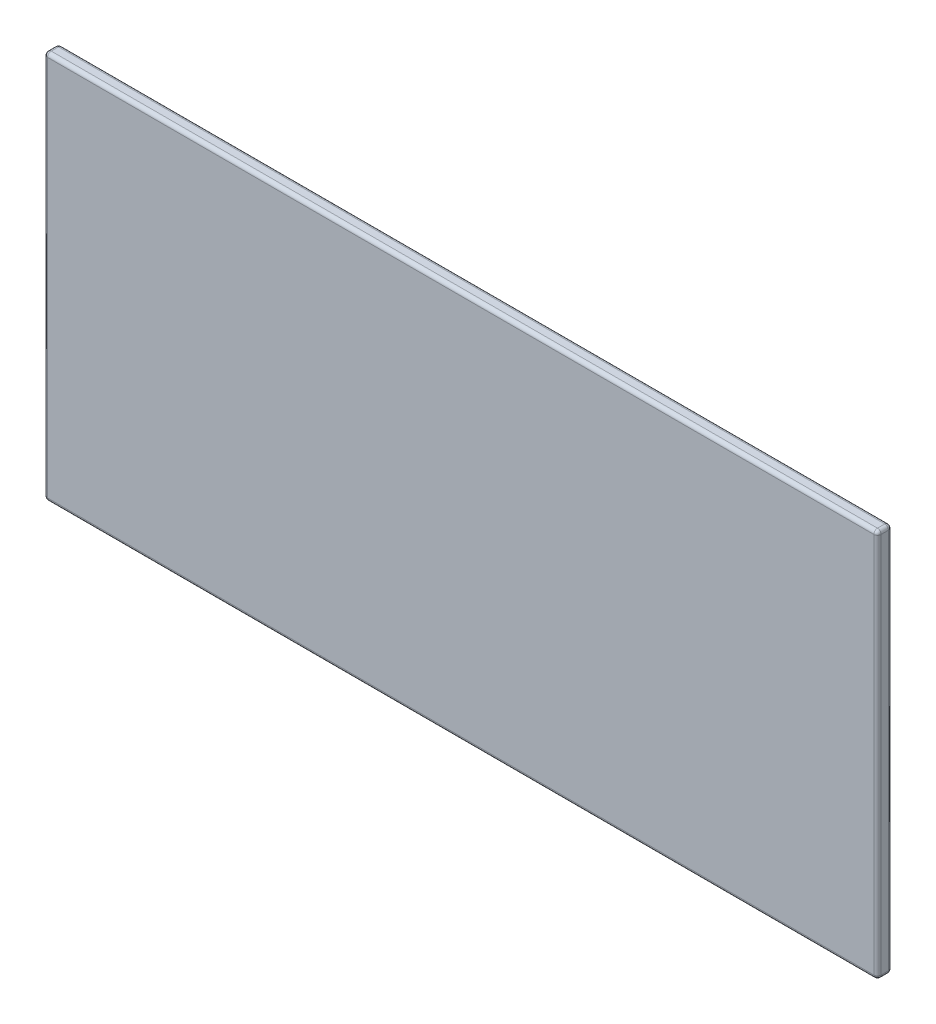
ISO-10303-21;
HEADER;
FILE_DESCRIPTION(('STEP AP214'),'2;1');
FILE_NAME('part.step','',(''),(''),'','','');
FILE_SCHEMA(('AUTOMOTIVE_DESIGN { 1 0 10303 214 1 1 1 1 }'));
ENDSEC;
DATA;
#1=APPLICATION_CONTEXT('core data for automotive mechanical design processes');
#2=APPLICATION_PROTOCOL_DEFINITION('international standard','automotive_design',2000,#1);
#3=PRODUCT_CONTEXT('',#1,'mechanical');
#4=PRODUCT('Part','Part','',(#3));
#5=PRODUCT_RELATED_PRODUCT_CATEGORY('part','',(#4));
#6=PRODUCT_DEFINITION_FORMATION('','',#4);
#7=PRODUCT_DEFINITION_CONTEXT('part definition',#1,'design');
#8=PRODUCT_DEFINITION('design','',#6,#7);
#9=PRODUCT_DEFINITION_SHAPE('','',#8);
#10=(LENGTH_UNIT() NAMED_UNIT(*) SI_UNIT(.MILLI.,.METRE.));
#11=(NAMED_UNIT(*) PLANE_ANGLE_UNIT() SI_UNIT($,.RADIAN.));
#12=(NAMED_UNIT(*) SI_UNIT($,.STERADIAN.) SOLID_ANGLE_UNIT());
#13=UNCERTAINTY_MEASURE_WITH_UNIT(LENGTH_MEASURE(1.E-05),#10,'distance_accuracy_value','');
#14=(GEOMETRIC_REPRESENTATION_CONTEXT(3) GLOBAL_UNCERTAINTY_ASSIGNED_CONTEXT((#13)) GLOBAL_UNIT_ASSIGNED_CONTEXT((#10,
#11,#12)) REPRESENTATION_CONTEXT('',''));
#15=CARTESIAN_POINT('',(0.,0.,0.));
#16=DIRECTION('',(0.,0.,1.));
#17=DIRECTION('',(1.,0.,0.));
#18=AXIS2_PLACEMENT_3D('',#15,#16,#17);
#19=CARTESIAN_POINT('',(57.35,-26.75,2.));
#20=DIRECTION('',(-1.,0.,0.));
#21=DIRECTION('',(0.,0.,1.));
#22=AXIS2_PLACEMENT_3D('',#19,#20,#21);
#23=PLANE('',#22);
#24=DIRECTION('',(0.,1.,0.));
#25=VECTOR('',#24,1.);
#26=CARTESIAN_POINT('',(57.35,-26.75,1.5));
#27=LINE('',#26,#25);
#28=CARTESIAN_POINT('',(57.35,26.25,1.5));
#29=VERTEX_POINT('',#28);
#30=CARTESIAN_POINT('',(57.35,-26.25,1.5));
#31=VERTEX_POINT('',#30);
#32=EDGE_CURVE('E42',#29,#31,#27,.F.);
#33=ORIENTED_EDGE('',*,*,#32,.T.);
#34=DIRECTION('',(0.,0.,-1.));
#35=VECTOR('',#34,1.);
#36=CARTESIAN_POINT('',(57.35,-26.25,2.));
#37=LINE('',#36,#35);
#38=CARTESIAN_POINT('',(57.35,-26.25,0.5));
#39=VERTEX_POINT('',#38);
#40=EDGE_CURVE('E11',#31,#39,#37,.T.);
#41=ORIENTED_EDGE('',*,*,#40,.T.);
#42=DIRECTION('',(0.,1.,0.));
#43=VECTOR('',#42,1.);
#44=CARTESIAN_POINT('',(57.35,26.75,0.5));
#45=LINE('',#44,#43);
#46=CARTESIAN_POINT('',(57.35,26.25,0.5));
#47=VERTEX_POINT('',#46);
#48=EDGE_CURVE('E194',#39,#47,#45,.T.);
#49=ORIENTED_EDGE('',*,*,#48,.T.);
#50=DIRECTION('',(0.,0.,-1.));
#51=VECTOR('',#50,1.);
#52=CARTESIAN_POINT('',(57.35,26.25,2.));
#53=LINE('',#52,#51);
#54=EDGE_CURVE('E53',#47,#29,#53,.F.);
#55=ORIENTED_EDGE('',*,*,#54,.T.);
#56=EDGE_LOOP('',(#33,#41,#49,#55));
#57=FACE_BOUND('',#56,.T.);
#58=ADVANCED_FACE('F33',(#57),#23,.F.);
#59=CARTESIAN_POINT('',(-57.35,26.75,2.));
#60=DIRECTION('',(0.,-1.,0.));
#61=DIRECTION('',(0.,0.,-1.));
#62=AXIS2_PLACEMENT_3D('',#59,#60,#61);
#63=PLANE('',#62);
#64=DIRECTION('',(0.,0.,-1.));
#65=VECTOR('',#64,1.);
#66=CARTESIAN_POINT('',(-56.85,26.75,2.));
#67=LINE('',#66,#65);
#68=CARTESIAN_POINT('',(-56.85,26.75,0.5));
#69=VERTEX_POINT('',#68);
#70=CARTESIAN_POINT('',(-56.85,26.75,1.5));
#71=VERTEX_POINT('',#70);
#72=EDGE_CURVE('E189',#69,#71,#67,.F.);
#73=ORIENTED_EDGE('',*,*,#72,.T.);
#74=DIRECTION('',(-1.,0.,0.));
#75=VECTOR('',#74,1.);
#76=CARTESIAN_POINT('',(-57.35,26.75,1.5));
#77=LINE('',#76,#75);
#78=CARTESIAN_POINT('',(56.85,26.75,1.5));
#79=VERTEX_POINT('',#78);
#80=EDGE_CURVE('E191',#71,#79,#77,.F.);
#81=ORIENTED_EDGE('',*,*,#80,.T.);
#82=DIRECTION('',(0.,0.,-1.));
#83=VECTOR('',#82,1.);
#84=CARTESIAN_POINT('',(56.85,26.75,2.));
#85=LINE('',#84,#83);
#86=CARTESIAN_POINT('',(56.85,26.75,0.5));
#87=VERTEX_POINT('',#86);
#88=EDGE_CURVE('E185',#79,#87,#85,.T.);
#89=ORIENTED_EDGE('',*,*,#88,.T.);
#90=DIRECTION('',(-1.,0.,0.));
#91=VECTOR('',#90,1.);
#92=CARTESIAN_POINT('',(-57.35,26.75,0.5));
#93=LINE('',#92,#91);
#94=EDGE_CURVE('E187',#87,#69,#93,.T.);
#95=ORIENTED_EDGE('',*,*,#94,.T.);
#96=EDGE_LOOP('',(#73,#81,#89,#95));
#97=FACE_BOUND('',#96,.T.);
#98=ADVANCED_FACE('F278',(#97),#63,.F.);
#99=CARTESIAN_POINT('',(-57.35,-26.75,2.));
#100=DIRECTION('',(1.,0.,0.));
#101=DIRECTION('',(0.,0.,-1.));
#102=AXIS2_PLACEMENT_3D('',#99,#100,#101);
#103=PLANE('',#102);
#104=DIRECTION('',(0.,0.,-1.));
#105=VECTOR('',#104,1.);
#106=CARTESIAN_POINT('',(-57.35,-26.25,2.));
#107=LINE('',#106,#105);
#108=CARTESIAN_POINT('',(-57.35,-26.25,0.5));
#109=VERTEX_POINT('',#108);
#110=CARTESIAN_POINT('',(-57.35,-26.25,1.5));
#111=VERTEX_POINT('',#110);
#112=EDGE_CURVE('E180',#109,#111,#107,.F.);
#113=ORIENTED_EDGE('',*,*,#112,.T.);
#114=DIRECTION('',(0.,-1.,0.));
#115=VECTOR('',#114,1.);
#116=CARTESIAN_POINT('',(-57.35,-26.75,1.5));
#117=LINE('',#116,#115);
#118=CARTESIAN_POINT('',(-57.35,26.25,1.5));
#119=VERTEX_POINT('',#118);
#120=EDGE_CURVE('E182',#111,#119,#117,.F.);
#121=ORIENTED_EDGE('',*,*,#120,.T.);
#122=DIRECTION('',(0.,0.,-1.));
#123=VECTOR('',#122,1.);
#124=CARTESIAN_POINT('',(-57.35,26.25,2.));
#125=LINE('',#124,#123);
#126=CARTESIAN_POINT('',(-57.35,26.25,0.5));
#127=VERTEX_POINT('',#126);
#128=EDGE_CURVE('E176',#119,#127,#125,.T.);
#129=ORIENTED_EDGE('',*,*,#128,.T.);
#130=DIRECTION('',(0.,-1.,0.));
#131=VECTOR('',#130,1.);
#132=CARTESIAN_POINT('',(-57.35,-26.75,0.5));
#133=LINE('',#132,#131);
#134=EDGE_CURVE('E178',#127,#109,#133,.T.);
#135=ORIENTED_EDGE('',*,*,#134,.T.);
#136=EDGE_LOOP('',(#113,#121,#129,#135));
#137=FACE_BOUND('',#136,.T.);
#138=ADVANCED_FACE('F269',(#137),#103,.F.);
#139=CARTESIAN_POINT('',(-57.35,-26.75,2.));
#140=DIRECTION('',(0.,1.,0.));
#141=DIRECTION('',(0.,0.,1.));
#142=AXIS2_PLACEMENT_3D('',#139,#140,#141);
#143=PLANE('',#142);
#144=DIRECTION('',(1.,0.,0.));
#145=VECTOR('',#144,1.);
#146=CARTESIAN_POINT('',(-57.35,-26.75,1.5));
#147=LINE('',#146,#145);
#148=CARTESIAN_POINT('',(56.85,-26.75,1.5));
#149=VERTEX_POINT('',#148);
#150=CARTESIAN_POINT('',(-56.85,-26.75,1.5));
#151=VERTEX_POINT('',#150);
#152=EDGE_CURVE('E129',#149,#151,#147,.F.);
#153=ORIENTED_EDGE('',*,*,#152,.T.);
#154=DIRECTION('',(0.,0.,-1.));
#155=VECTOR('',#154,1.);
#156=CARTESIAN_POINT('',(-56.85,-26.75,2.));
#157=LINE('',#156,#155);
#158=CARTESIAN_POINT('',(-56.85,-26.75,0.5));
#159=VERTEX_POINT('',#158);
#160=EDGE_CURVE('E165',#151,#159,#157,.T.);
#161=ORIENTED_EDGE('',*,*,#160,.T.);
#162=DIRECTION('',(1.,0.,0.));
#163=VECTOR('',#162,1.);
#164=CARTESIAN_POINT('',(57.35,-26.75,0.5));
#165=LINE('',#164,#163);
#166=CARTESIAN_POINT('',(56.85,-26.75,0.5));
#167=VERTEX_POINT('',#166);
#168=EDGE_CURVE('E158',#159,#167,#165,.T.);
#169=ORIENTED_EDGE('',*,*,#168,.T.);
#170=DIRECTION('',(0.,0.,-1.));
#171=VECTOR('',#170,1.);
#172=CARTESIAN_POINT('',(56.85,-26.75,2.));
#173=LINE('',#172,#171);
#174=EDGE_CURVE('E156',#167,#149,#173,.F.);
#175=ORIENTED_EDGE('',*,*,#174,.T.);
#176=EDGE_LOOP('',(#153,#161,#169,#175));
#177=FACE_BOUND('',#176,.T.);
#178=ADVANCED_FACE('F356',(#177),#143,.F.);
#179=CARTESIAN_POINT('',(0.,0.,2.));
#180=DIRECTION('',(0.,0.,-1.));
#181=DIRECTION('',(-1.,0.,0.));
#182=AXIS2_PLACEMENT_3D('',#179,#180,#181);
#183=PLANE('',#182);
#184=DIRECTION('',(0.,-1.,0.));
#185=VECTOR('',#184,1.);
#186=CARTESIAN_POINT('',(-56.85,0.,2.));
#187=LINE('',#186,#185);
#188=CARTESIAN_POINT('',(-56.85,26.25,2.));
#189=VERTEX_POINT('',#188);
#190=CARTESIAN_POINT('',(-56.85,-26.25,2.));
#191=VERTEX_POINT('',#190);
#192=EDGE_CURVE('E154',#189,#191,#187,.T.);
#193=ORIENTED_EDGE('',*,*,#192,.T.);
#194=DIRECTION('',(1.,0.,0.));
#195=VECTOR('',#194,1.);
#196=CARTESIAN_POINT('',(0.,-26.25,2.));
#197=LINE('',#196,#195);
#198=CARTESIAN_POINT('',(56.85,-26.25,2.));
#199=VERTEX_POINT('',#198);
#200=EDGE_CURVE('E127',#191,#199,#197,.T.);
#201=ORIENTED_EDGE('',*,*,#200,.T.);
#202=DIRECTION('',(0.,1.,0.));
#203=VECTOR('',#202,1.);
#204=CARTESIAN_POINT('',(56.85,0.,2.));
#205=LINE('',#204,#203);
#206=CARTESIAN_POINT('',(56.85,26.25,2.));
#207=VERTEX_POINT('',#206);
#208=EDGE_CURVE('E144',#199,#207,#205,.T.);
#209=ORIENTED_EDGE('',*,*,#208,.T.);
#210=DIRECTION('',(-1.,0.,0.));
#211=VECTOR('',#210,1.);
#212=CARTESIAN_POINT('',(0.,26.25,2.));
#213=LINE('',#212,#211);
#214=EDGE_CURVE('E150',#207,#189,#213,.T.);
#215=ORIENTED_EDGE('',*,*,#214,.T.);
#216=EDGE_LOOP('',(#193,#201,#209,#215));
#217=FACE_BOUND('',#216,.T.);
#218=ADVANCED_FACE('F152',(#217),#183,.F.);
#219=CARTESIAN_POINT('',(0.,0.,0.));
#220=DIRECTION('',(0.,0.,-1.));
#221=DIRECTION('',(-1.,0.,0.));
#222=AXIS2_PLACEMENT_3D('',#219,#220,#221);
#223=PLANE('',#222);
#224=DIRECTION('',(0.,1.,0.));
#225=VECTOR('',#224,1.);
#226=CARTESIAN_POINT('',(56.85,-26.75,0.));
#227=LINE('',#226,#225);
#228=CARTESIAN_POINT('',(56.85,26.25,0.));
#229=VERTEX_POINT('',#228);
#230=CARTESIAN_POINT('',(56.85,-26.25,0.));
#231=VERTEX_POINT('',#230);
#232=EDGE_CURVE('E167',#229,#231,#227,.F.);
#233=ORIENTED_EDGE('',*,*,#232,.T.);
#234=DIRECTION('',(1.,0.,0.));
#235=VECTOR('',#234,1.);
#236=CARTESIAN_POINT('',(-57.35,-26.25,0.));
#237=LINE('',#236,#235);
#238=CARTESIAN_POINT('',(-56.85,-26.25,0.));
#239=VERTEX_POINT('',#238);
#240=EDGE_CURVE('E173',#231,#239,#237,.F.);
#241=ORIENTED_EDGE('',*,*,#240,.T.);
#242=DIRECTION('',(0.,-1.,0.));
#243=VECTOR('',#242,1.);
#244=CARTESIAN_POINT('',(-56.85,26.75,0.));
#245=LINE('',#244,#243);
#246=CARTESIAN_POINT('',(-56.85,26.25,0.));
#247=VERTEX_POINT('',#246);
#248=EDGE_CURVE('E171',#239,#247,#245,.F.);
#249=ORIENTED_EDGE('',*,*,#248,.T.);
#250=DIRECTION('',(-1.,0.,0.));
#251=VECTOR('',#250,1.);
#252=CARTESIAN_POINT('',(57.35,26.25,0.));
#253=LINE('',#252,#251);
#254=EDGE_CURVE('E169',#247,#229,#253,.F.);
#255=ORIENTED_EDGE('',*,*,#254,.T.);
#256=EDGE_LOOP('',(#233,#241,#249,#255));
#257=FACE_BOUND('',#256,.T.);
#258=ADVANCED_FACE('F296',(#257),#223,.T.);
#259=CARTESIAN_POINT('',(-57.35,26.25,0.5));
#260=DIRECTION('',(1.,0.,0.));
#261=DIRECTION('',(0.,0.,-1.));
#262=AXIS2_PLACEMENT_3D('',#259,#260,#261);
#263=CYLINDRICAL_SURFACE('',#262,0.5);
#264=CARTESIAN_POINT('',(-56.85,26.25,0.5));
#265=DIRECTION('',(-1.,0.,0.));
#266=DIRECTION('',(0.,0.,1.));
#267=AXIS2_PLACEMENT_3D('',#264,#265,#266);
#268=CIRCLE('',#267,0.5);
#269=EDGE_CURVE('E37',#69,#247,#268,.T.);
#270=ORIENTED_EDGE('',*,*,#269,.F.);
#271=ORIENTED_EDGE('',*,*,#94,.F.);
#272=CARTESIAN_POINT('',(56.85,26.25,0.5));
#273=DIRECTION('',(1.,0.,0.));
#274=DIRECTION('',(0.,0.,-1.));
#275=AXIS2_PLACEMENT_3D('',#272,#273,#274);
#276=CIRCLE('',#275,0.5);
#277=EDGE_CURVE('E246',#229,#87,#276,.T.);
#278=ORIENTED_EDGE('',*,*,#277,.F.);
#279=ORIENTED_EDGE('',*,*,#254,.F.);
#280=EDGE_LOOP('',(#270,#271,#278,#279));
#281=FACE_BOUND('',#280,.T.);
#282=ADVANCED_FACE('F35',(#281),#263,.T.);
#283=CARTESIAN_POINT('',(-56.85,26.25,0.5));
#284=DIRECTION('',(0.,0.,1.));
#285=DIRECTION('',(1.,0.,0.));
#286=AXIS2_PLACEMENT_3D('',#283,#284,#285);
#287=SPHERICAL_SURFACE('',#286,0.5);
#288=CARTESIAN_POINT('',(-56.85,26.25,0.5));
#289=DIRECTION('',(0.,0.,-1.));
#290=DIRECTION('',(-1.,0.,0.));
#291=AXIS2_PLACEMENT_3D('',#288,#289,#290);
#292=CIRCLE('',#291,0.5);
#293=EDGE_CURVE('E241',#69,#127,#292,.F.);
#294=ORIENTED_EDGE('',*,*,#293,.F.);
#295=ORIENTED_EDGE('',*,*,#269,.T.);
#296=CARTESIAN_POINT('',(-56.85,26.25,0.5));
#297=DIRECTION('',(0.,1.,0.));
#298=DIRECTION('',(0.,0.,1.));
#299=AXIS2_PLACEMENT_3D('',#296,#297,#298);
#300=CIRCLE('',#299,0.5);
#301=EDGE_CURVE('E244',#127,#247,#300,.F.);
#302=ORIENTED_EDGE('',*,*,#301,.F.);
#303=EDGE_LOOP('',(#294,#295,#302));
#304=FACE_BOUND('',#303,.T.);
#305=ADVANCED_FACE('F257',(#304),#287,.T.);
#306=CARTESIAN_POINT('',(56.85,26.25,0.5));
#307=DIRECTION('',(0.,0.,1.));
#308=DIRECTION('',(1.,0.,0.));
#309=AXIS2_PLACEMENT_3D('',#306,#307,#308);
#310=SPHERICAL_SURFACE('',#309,0.5);
#311=CARTESIAN_POINT('',(56.85,26.25,0.5));
#312=DIRECTION('',(0.,1.,0.));
#313=DIRECTION('',(0.,0.,1.));
#314=AXIS2_PLACEMENT_3D('',#311,#312,#313);
#315=CIRCLE('',#314,0.5);
#316=EDGE_CURVE('E235',#229,#47,#315,.F.);
#317=ORIENTED_EDGE('',*,*,#316,.F.);
#318=ORIENTED_EDGE('',*,*,#277,.T.);
#319=CARTESIAN_POINT('',(56.85,26.25,0.5));
#320=DIRECTION('',(0.,0.,-1.));
#321=DIRECTION('',(-1.,0.,0.));
#322=AXIS2_PLACEMENT_3D('',#319,#320,#321);
#323=CIRCLE('',#322,0.5);
#324=EDGE_CURVE('E238',#47,#87,#323,.F.);
#325=ORIENTED_EDGE('',*,*,#324,.F.);
#326=EDGE_LOOP('',(#317,#318,#325));
#327=FACE_BOUND('',#326,.T.);
#328=ADVANCED_FACE('F289',(#327),#310,.T.);
#329=CARTESIAN_POINT('',(-56.85,-26.75,0.5));
#330=DIRECTION('',(0.,1.,0.));
#331=DIRECTION('',(0.,0.,1.));
#332=AXIS2_PLACEMENT_3D('',#329,#330,#331);
#333=CYLINDRICAL_SURFACE('',#332,0.5);
#334=ORIENTED_EDGE('',*,*,#301,.T.);
#335=ORIENTED_EDGE('',*,*,#248,.F.);
#336=CARTESIAN_POINT('',(-56.85,-26.25,0.5));
#337=DIRECTION('',(0.,-1.,0.));
#338=DIRECTION('',(0.,0.,-1.));
#339=AXIS2_PLACEMENT_3D('',#336,#337,#338);
#340=CIRCLE('',#339,0.5);
#341=EDGE_CURVE('E230',#109,#239,#340,.T.);
#342=ORIENTED_EDGE('',*,*,#341,.F.);
#343=ORIENTED_EDGE('',*,*,#134,.F.);
#344=EDGE_LOOP('',(#334,#335,#342,#343));
#345=FACE_BOUND('',#344,.T.);
#346=ADVANCED_FACE('F265',(#345),#333,.T.);
#347=CARTESIAN_POINT('',(-56.85,26.25,2.));
#348=DIRECTION('',(0.,0.,-1.));
#349=DIRECTION('',(-1.,0.,0.));
#350=AXIS2_PLACEMENT_3D('',#347,#348,#349);
#351=CYLINDRICAL_SURFACE('',#350,0.5);
#352=ORIENTED_EDGE('',*,*,#293,.T.);
#353=ORIENTED_EDGE('',*,*,#128,.F.);
#354=CARTESIAN_POINT('',(-56.85,26.25,1.5));
#355=DIRECTION('',(0.,0.,1.));
#356=DIRECTION('',(1.,0.,0.));
#357=AXIS2_PLACEMENT_3D('',#354,#355,#356);
#358=CIRCLE('',#357,0.5);
#359=EDGE_CURVE('E227',#71,#119,#358,.T.);
#360=ORIENTED_EDGE('',*,*,#359,.F.);
#361=ORIENTED_EDGE('',*,*,#72,.F.);
#362=EDGE_LOOP('',(#352,#353,#360,#361));
#363=FACE_BOUND('',#362,.T.);
#364=ADVANCED_FACE('F275',(#363),#351,.T.);
#365=CARTESIAN_POINT('',(0.,26.25,1.5));
#366=DIRECTION('',(-1.,0.,0.));
#367=DIRECTION('',(0.,0.,1.));
#368=AXIS2_PLACEMENT_3D('',#365,#366,#367);
#369=CYLINDRICAL_SURFACE('',#368,0.5);
#370=CARTESIAN_POINT('',(56.85,26.25,1.5));
#371=DIRECTION('',(1.,0.,0.));
#372=DIRECTION('',(0.,0.,-1.));
#373=AXIS2_PLACEMENT_3D('',#370,#371,#372);
#374=CIRCLE('',#373,0.5);
#375=EDGE_CURVE('E221',#79,#207,#374,.T.);
#376=ORIENTED_EDGE('',*,*,#375,.F.);
#377=ORIENTED_EDGE('',*,*,#80,.F.);
#378=CARTESIAN_POINT('',(-56.85,26.25,1.5));
#379=DIRECTION('',(-1.,0.,0.));
#380=DIRECTION('',(0.,0.,1.));
#381=AXIS2_PLACEMENT_3D('',#378,#379,#380);
#382=CIRCLE('',#381,0.5);
#383=EDGE_CURVE('E224',#189,#71,#382,.T.);
#384=ORIENTED_EDGE('',*,*,#383,.F.);
#385=ORIENTED_EDGE('',*,*,#214,.F.);
#386=EDGE_LOOP('',(#376,#377,#384,#385));
#387=FACE_BOUND('',#386,.T.);
#388=ADVANCED_FACE('F282',(#387),#369,.T.);
#389=CARTESIAN_POINT('',(56.85,26.25,2.));
#390=DIRECTION('',(0.,0.,-1.));
#391=DIRECTION('',(-1.,0.,0.));
#392=AXIS2_PLACEMENT_3D('',#389,#390,#391);
#393=CYLINDRICAL_SURFACE('',#392,0.5);
#394=ORIENTED_EDGE('',*,*,#324,.T.);
#395=ORIENTED_EDGE('',*,*,#88,.F.);
#396=CARTESIAN_POINT('',(56.85,26.25,1.5));
#397=DIRECTION('',(0.,0.,1.));
#398=DIRECTION('',(1.,0.,0.));
#399=AXIS2_PLACEMENT_3D('',#396,#397,#398);
#400=CIRCLE('',#399,0.5);
#401=EDGE_CURVE('E219',#29,#79,#400,.T.);
#402=ORIENTED_EDGE('',*,*,#401,.F.);
#403=ORIENTED_EDGE('',*,*,#54,.F.);
#404=EDGE_LOOP('',(#394,#395,#402,#403));
#405=FACE_BOUND('',#404,.T.);
#406=ADVANCED_FACE('F287',(#405),#393,.T.);
#407=CARTESIAN_POINT('',(56.85,-26.75,0.5));
#408=DIRECTION('',(0.,-1.,0.));
#409=DIRECTION('',(0.,0.,-1.));
#410=AXIS2_PLACEMENT_3D('',#407,#408,#409);
#411=CYLINDRICAL_SURFACE('',#410,0.5);
#412=ORIENTED_EDGE('',*,*,#316,.T.);
#413=ORIENTED_EDGE('',*,*,#48,.F.);
#414=CARTESIAN_POINT('',(56.85,-26.25,0.5));
#415=DIRECTION('',(0.,-1.,0.));
#416=DIRECTION('',(0.,0.,-1.));
#417=AXIS2_PLACEMENT_3D('',#414,#415,#416);
#418=CIRCLE('',#417,0.5);
#419=EDGE_CURVE('E216',#231,#39,#418,.T.);
#420=ORIENTED_EDGE('',*,*,#419,.F.);
#421=ORIENTED_EDGE('',*,*,#232,.F.);
#422=EDGE_LOOP('',(#412,#413,#420,#421));
#423=FACE_BOUND('',#422,.T.);
#424=ADVANCED_FACE('F293',(#423),#411,.T.);
#425=CARTESIAN_POINT('',(-57.35,-26.25,0.5));
#426=DIRECTION('',(-1.,0.,0.));
#427=DIRECTION('',(0.,0.,1.));
#428=AXIS2_PLACEMENT_3D('',#425,#426,#427);
#429=CYLINDRICAL_SURFACE('',#428,0.5);
#430=CARTESIAN_POINT('',(-56.85,-26.25,0.5));
#431=DIRECTION('',(-1.,0.,0.));
#432=DIRECTION('',(0.,0.,1.));
#433=AXIS2_PLACEMENT_3D('',#430,#431,#432);
#434=CIRCLE('',#433,0.5);
#435=EDGE_CURVE('E232',#239,#159,#434,.T.);
#436=ORIENTED_EDGE('',*,*,#435,.F.);
#437=ORIENTED_EDGE('',*,*,#240,.F.);
#438=CARTESIAN_POINT('',(56.85,-26.25,0.5));
#439=DIRECTION('',(1.,0.,0.));
#440=DIRECTION('',(0.,0.,-1.));
#441=AXIS2_PLACEMENT_3D('',#438,#439,#440);
#442=CIRCLE('',#441,0.5);
#443=EDGE_CURVE('E213',#167,#231,#442,.T.);
#444=ORIENTED_EDGE('',*,*,#443,.F.);
#445=ORIENTED_EDGE('',*,*,#168,.F.);
#446=EDGE_LOOP('',(#436,#437,#444,#445));
#447=FACE_BOUND('',#446,.T.);
#448=ADVANCED_FACE('F300',(#447),#429,.T.);
#449=CARTESIAN_POINT('',(-56.85,-26.25,0.5));
#450=DIRECTION('',(0.,0.,1.));
#451=DIRECTION('',(1.,0.,0.));
#452=AXIS2_PLACEMENT_3D('',#449,#450,#451);
#453=SPHERICAL_SURFACE('',#452,0.5);
#454=ORIENTED_EDGE('',*,*,#341,.T.);
#455=ORIENTED_EDGE('',*,*,#435,.T.);
#456=CARTESIAN_POINT('',(-56.85,-26.25,0.5));
#457=DIRECTION('',(0.,0.,-1.));
#458=DIRECTION('',(-1.,0.,0.));
#459=AXIS2_PLACEMENT_3D('',#456,#457,#458);
#460=CIRCLE('',#459,0.5);
#461=EDGE_CURVE('E210',#109,#159,#460,.F.);
#462=ORIENTED_EDGE('',*,*,#461,.F.);
#463=EDGE_LOOP('',(#454,#455,#462));
#464=FACE_BOUND('',#463,.T.);
#465=ADVANCED_FACE('F304',(#464),#453,.T.);
#466=CARTESIAN_POINT('',(-56.85,26.25,1.5));
#467=DIRECTION('',(0.,0.,1.));
#468=DIRECTION('',(1.,0.,0.));
#469=AXIS2_PLACEMENT_3D('',#466,#467,#468);
#470=SPHERICAL_SURFACE('',#469,0.5);
#471=ORIENTED_EDGE('',*,*,#383,.T.);
#472=ORIENTED_EDGE('',*,*,#359,.T.);
#473=CARTESIAN_POINT('',(-56.85,26.25,1.5));
#474=DIRECTION('',(0.,1.,0.));
#475=DIRECTION('',(0.,0.,1.));
#476=AXIS2_PLACEMENT_3D('',#473,#474,#475);
#477=CIRCLE('',#476,0.5);
#478=EDGE_CURVE('E208',#189,#119,#477,.F.);
#479=ORIENTED_EDGE('',*,*,#478,.F.);
#480=EDGE_LOOP('',(#471,#472,#479));
#481=FACE_BOUND('',#480,.T.);
#482=ADVANCED_FACE('F315',(#481),#470,.T.);
#483=CARTESIAN_POINT('',(56.85,26.25,1.5));
#484=DIRECTION('',(0.,0.,1.));
#485=DIRECTION('',(1.,0.,0.));
#486=AXIS2_PLACEMENT_3D('',#483,#484,#485);
#487=SPHERICAL_SURFACE('',#486,0.5);
#488=ORIENTED_EDGE('',*,*,#401,.T.);
#489=ORIENTED_EDGE('',*,*,#375,.T.);
#490=CARTESIAN_POINT('',(56.85,26.25,1.5));
#491=DIRECTION('',(0.,1.,0.));
#492=DIRECTION('',(0.,0.,1.));
#493=AXIS2_PLACEMENT_3D('',#490,#491,#492);
#494=CIRCLE('',#493,0.5);
#495=EDGE_CURVE('E147',#29,#207,#494,.F.);
#496=ORIENTED_EDGE('',*,*,#495,.F.);
#497=EDGE_LOOP('',(#488,#489,#496));
#498=FACE_BOUND('',#497,.T.);
#499=ADVANCED_FACE('F317',(#498),#487,.T.);
#500=CARTESIAN_POINT('',(56.85,-26.25,0.5));
#501=DIRECTION('',(0.,0.,1.));
#502=DIRECTION('',(1.,0.,0.));
#503=AXIS2_PLACEMENT_3D('',#500,#501,#502);
#504=SPHERICAL_SURFACE('',#503,0.5);
#505=ORIENTED_EDGE('',*,*,#443,.T.);
#506=ORIENTED_EDGE('',*,*,#419,.T.);
#507=CARTESIAN_POINT('',(56.85,-26.25,0.5));
#508=DIRECTION('',(0.,0.,-1.));
#509=DIRECTION('',(-1.,0.,0.));
#510=AXIS2_PLACEMENT_3D('',#507,#508,#509);
#511=CIRCLE('',#510,0.5);
#512=EDGE_CURVE('E205',#167,#39,#511,.F.);
#513=ORIENTED_EDGE('',*,*,#512,.F.);
#514=EDGE_LOOP('',(#505,#506,#513));
#515=FACE_BOUND('',#514,.T.);
#516=ADVANCED_FACE('F323',(#515),#504,.T.);
#517=CARTESIAN_POINT('',(-56.85,-26.25,2.));
#518=DIRECTION('',(0.,0.,-1.));
#519=DIRECTION('',(-1.,0.,0.));
#520=AXIS2_PLACEMENT_3D('',#517,#518,#519);
#521=CYLINDRICAL_SURFACE('',#520,0.5);
#522=ORIENTED_EDGE('',*,*,#461,.T.);
#523=ORIENTED_EDGE('',*,*,#160,.F.);
#524=CARTESIAN_POINT('',(-56.85,-26.25,1.5));
#525=DIRECTION('',(0.,0.,1.));
#526=DIRECTION('',(1.,0.,0.));
#527=AXIS2_PLACEMENT_3D('',#524,#525,#526);
#528=CIRCLE('',#527,0.5);
#529=EDGE_CURVE('E202',#111,#151,#528,.T.);
#530=ORIENTED_EDGE('',*,*,#529,.F.);
#531=ORIENTED_EDGE('',*,*,#112,.F.);
#532=EDGE_LOOP('',(#522,#523,#530,#531));
#533=FACE_BOUND('',#532,.T.);
#534=ADVANCED_FACE('F307',(#533),#521,.T.);
#535=CARTESIAN_POINT('',(-56.85,0.,1.5));
#536=DIRECTION('',(0.,-1.,0.));
#537=DIRECTION('',(0.,0.,-1.));
#538=AXIS2_PLACEMENT_3D('',#535,#536,#537);
#539=CYLINDRICAL_SURFACE('',#538,0.5);
#540=ORIENTED_EDGE('',*,*,#478,.T.);
#541=ORIENTED_EDGE('',*,*,#120,.F.);
#542=CARTESIAN_POINT('',(-56.85,-26.25,1.5));
#543=DIRECTION('',(0.,-1.,0.));
#544=DIRECTION('',(0.,0.,-1.));
#545=AXIS2_PLACEMENT_3D('',#542,#543,#544);
#546=CIRCLE('',#545,0.5);
#547=EDGE_CURVE('E141',#191,#111,#546,.T.);
#548=ORIENTED_EDGE('',*,*,#547,.F.);
#549=ORIENTED_EDGE('',*,*,#192,.F.);
#550=EDGE_LOOP('',(#540,#541,#548,#549));
#551=FACE_BOUND('',#550,.T.);
#552=ADVANCED_FACE('F313',(#551),#539,.T.);
#553=CARTESIAN_POINT('',(56.85,0.,1.5));
#554=DIRECTION('',(0.,1.,0.));
#555=DIRECTION('',(0.,0.,1.));
#556=AXIS2_PLACEMENT_3D('',#553,#554,#555);
#557=CYLINDRICAL_SURFACE('',#556,0.5);
#558=ORIENTED_EDGE('',*,*,#495,.T.);
#559=ORIENTED_EDGE('',*,*,#208,.F.);
#560=CARTESIAN_POINT('',(56.85,-26.25,1.5));
#561=DIRECTION('',(0.,-1.,0.));
#562=DIRECTION('',(0.,0.,-1.));
#563=AXIS2_PLACEMENT_3D('',#560,#561,#562);
#564=CIRCLE('',#563,0.5);
#565=EDGE_CURVE('E135',#31,#199,#564,.T.);
#566=ORIENTED_EDGE('',*,*,#565,.F.);
#567=ORIENTED_EDGE('',*,*,#32,.F.);
#568=EDGE_LOOP('',(#558,#559,#566,#567));
#569=FACE_BOUND('',#568,.T.);
#570=ADVANCED_FACE('F145',(#569),#557,.T.);
#571=CARTESIAN_POINT('',(56.85,-26.25,2.));
#572=DIRECTION('',(0.,0.,-1.));
#573=DIRECTION('',(-1.,0.,0.));
#574=AXIS2_PLACEMENT_3D('',#571,#572,#573);
#575=CYLINDRICAL_SURFACE('',#574,0.5);
#576=ORIENTED_EDGE('',*,*,#512,.T.);
#577=ORIENTED_EDGE('',*,*,#40,.F.);
#578=CARTESIAN_POINT('',(56.85,-26.25,1.5));
#579=DIRECTION('',(0.,0.,1.));
#580=DIRECTION('',(1.,0.,0.));
#581=AXIS2_PLACEMENT_3D('',#578,#579,#580);
#582=CIRCLE('',#581,0.5);
#583=EDGE_CURVE('E139',#149,#31,#582,.T.);
#584=ORIENTED_EDGE('',*,*,#583,.F.);
#585=ORIENTED_EDGE('',*,*,#174,.F.);
#586=EDGE_LOOP('',(#576,#577,#584,#585));
#587=FACE_BOUND('',#586,.T.);
#588=ADVANCED_FACE('F340',(#587),#575,.T.);
#589=CARTESIAN_POINT('',(-56.85,-26.25,1.5));
#590=DIRECTION('',(0.,0.,1.));
#591=DIRECTION('',(1.,0.,0.));
#592=AXIS2_PLACEMENT_3D('',#589,#590,#591);
#593=SPHERICAL_SURFACE('',#592,0.5);
#594=ORIENTED_EDGE('',*,*,#547,.T.);
#595=ORIENTED_EDGE('',*,*,#529,.T.);
#596=CARTESIAN_POINT('',(-56.85,-26.25,1.5));
#597=DIRECTION('',(-1.,0.,0.));
#598=DIRECTION('',(0.,0.,1.));
#599=AXIS2_PLACEMENT_3D('',#596,#597,#598);
#600=CIRCLE('',#599,0.5);
#601=EDGE_CURVE('E132',#191,#151,#600,.F.);
#602=ORIENTED_EDGE('',*,*,#601,.F.);
#603=EDGE_LOOP('',(#594,#595,#602));
#604=FACE_BOUND('',#603,.T.);
#605=ADVANCED_FACE('F311',(#604),#593,.T.);
#606=CARTESIAN_POINT('',(56.85,-26.25,1.5));
#607=DIRECTION('',(0.,0.,1.));
#608=DIRECTION('',(1.,0.,0.));
#609=AXIS2_PLACEMENT_3D('',#606,#607,#608);
#610=SPHERICAL_SURFACE('',#609,0.5);
#611=ORIENTED_EDGE('',*,*,#583,.T.);
#612=ORIENTED_EDGE('',*,*,#565,.T.);
#613=CARTESIAN_POINT('',(56.85,-26.25,1.5));
#614=DIRECTION('',(1.,0.,0.));
#615=DIRECTION('',(0.,0.,-1.));
#616=AXIS2_PLACEMENT_3D('',#613,#614,#615);
#617=CIRCLE('',#616,0.5);
#618=EDGE_CURVE('E123',#149,#199,#617,.F.);
#619=ORIENTED_EDGE('',*,*,#618,.F.);
#620=EDGE_LOOP('',(#611,#612,#619));
#621=FACE_BOUND('',#620,.T.);
#622=ADVANCED_FACE('F137',(#621),#610,.T.);
#623=CARTESIAN_POINT('',(0.,-26.25,1.5));
#624=DIRECTION('',(1.,0.,0.));
#625=DIRECTION('',(0.,0.,-1.));
#626=AXIS2_PLACEMENT_3D('',#623,#624,#625);
#627=CYLINDRICAL_SURFACE('',#626,0.5);
#628=ORIENTED_EDGE('',*,*,#601,.T.);
#629=ORIENTED_EDGE('',*,*,#152,.F.);
#630=ORIENTED_EDGE('',*,*,#618,.T.);
#631=ORIENTED_EDGE('',*,*,#200,.F.);
#632=EDGE_LOOP('',(#628,#629,#630,#631));
#633=FACE_BOUND('',#632,.T.);
#634=ADVANCED_FACE('F125',(#633),#627,.T.);
#635=CLOSED_SHELL('',(#58,#98,#138,#178,#218,#258,#282,#305,#328,#346,#364,#388,#406,#424,#448,
#465,#482,#499,#516,#534,#552,#570,#588,#605,#622,#634));
#636=MANIFOLD_SOLID_BREP('B2',#635);
#637=ADVANCED_BREP_SHAPE_REPRESENTATION('',(#18,#636),#14);
#638=SHAPE_DEFINITION_REPRESENTATION(#9,#637);
ENDSEC;
END-ISO-10303-21;
